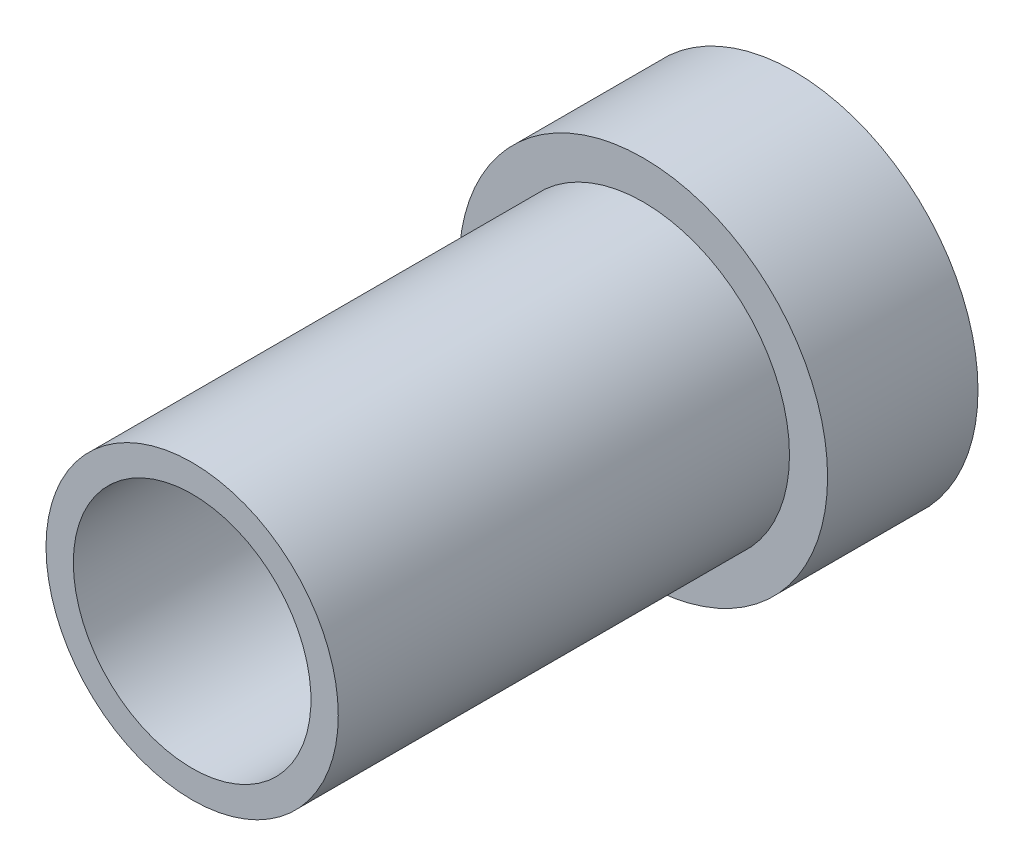
ISO-10303-21;
HEADER;
FILE_DESCRIPTION(('STEP AP214'),'2;1');
FILE_NAME('part.step','',(''),(''),'','','');
FILE_SCHEMA(('AUTOMOTIVE_DESIGN { 1 0 10303 214 1 1 1 1 }'));
ENDSEC;
DATA;
#1=APPLICATION_CONTEXT('core data for automotive mechanical design processes');
#2=APPLICATION_PROTOCOL_DEFINITION('international standard','automotive_design',2000,#1);
#3=PRODUCT_CONTEXT('',#1,'mechanical');
#4=PRODUCT('Part','Part','',(#3));
#5=PRODUCT_RELATED_PRODUCT_CATEGORY('part','',(#4));
#6=PRODUCT_DEFINITION_FORMATION('','',#4);
#7=PRODUCT_DEFINITION_CONTEXT('part definition',#1,'design');
#8=PRODUCT_DEFINITION('design','',#6,#7);
#9=PRODUCT_DEFINITION_SHAPE('','',#8);
#10=(LENGTH_UNIT() NAMED_UNIT(*) SI_UNIT(.MILLI.,.METRE.));
#11=(NAMED_UNIT(*) PLANE_ANGLE_UNIT() SI_UNIT($,.RADIAN.));
#12=(NAMED_UNIT(*) SI_UNIT($,.STERADIAN.) SOLID_ANGLE_UNIT());
#13=UNCERTAINTY_MEASURE_WITH_UNIT(LENGTH_MEASURE(1.E-05),#10,'distance_accuracy_value','');
#14=(GEOMETRIC_REPRESENTATION_CONTEXT(3) GLOBAL_UNCERTAINTY_ASSIGNED_CONTEXT((#13)) GLOBAL_UNIT_ASSIGNED_CONTEXT((#10,
#11,#12)) REPRESENTATION_CONTEXT('',''));
#15=CARTESIAN_POINT('',(0.,0.,0.));
#16=DIRECTION('',(0.,0.,1.));
#17=DIRECTION('',(1.,0.,0.));
#18=AXIS2_PLACEMENT_3D('',#15,#16,#17);
#19=CARTESIAN_POINT('',(0.,0.,80.));
#20=DIRECTION('',(0.,0.,-1.));
#21=DIRECTION('',(-1.,0.,0.));
#22=AXIS2_PLACEMENT_3D('',#19,#20,#21);
#23=CYLINDRICAL_SURFACE('',#22,18.255);
#24=CARTESIAN_POINT('',(0.,0.,0.));
#25=DIRECTION('',(0.,0.,-1.));
#26=DIRECTION('',(-1.,0.,0.));
#27=AXIS2_PLACEMENT_3D('',#24,#25,#26);
#28=CIRCLE('',#27,18.255);
#29=CARTESIAN_POINT('',(-18.255,0.,0.));
#30=VERTEX_POINT('',#29);
#31=EDGE_CURVE('E10',#30,#30,#28,.T.);
#32=ORIENTED_EDGE('',*,*,#31,.T.);
#33=EDGE_LOOP('',(#32));
#34=FACE_BOUND('',#33,.T.);
#35=CARTESIAN_POINT('',(0.,0.,20.));
#36=DIRECTION('',(0.,0.,-1.));
#37=DIRECTION('',(-1.,0.,0.));
#38=AXIS2_PLACEMENT_3D('',#35,#36,#37);
#39=CIRCLE('',#38,18.255);
#40=CARTESIAN_POINT('',(-18.255,0.,20.));
#41=VERTEX_POINT('',#40);
#42=EDGE_CURVE('E59',#41,#41,#39,.T.);
#43=ORIENTED_EDGE('',*,*,#42,.F.);
#44=EDGE_LOOP('',(#43));
#45=FACE_BOUND('',#44,.T.);
#46=ADVANCED_FACE('F31',(#34,#45),#23,.F.);
#47=CARTESIAN_POINT('',(18.255,0.,0.));
#48=DIRECTION('',(0.,0.,-1.));
#49=DIRECTION('',(-1.,0.,0.));
#50=AXIS2_PLACEMENT_3D('',#47,#48,#49);
#51=PLANE('',#50);
#52=CARTESIAN_POINT('',(0.,0.,0.));
#53=DIRECTION('',(0.,0.,-1.));
#54=DIRECTION('',(-1.,0.,0.));
#55=AXIS2_PLACEMENT_3D('',#52,#53,#54);
#56=CIRCLE('',#55,24.5);
#57=CARTESIAN_POINT('',(-24.5,0.,0.));
#58=VERTEX_POINT('',#57);
#59=EDGE_CURVE('E37',#58,#58,#56,.T.);
#60=ORIENTED_EDGE('',*,*,#59,.T.);
#61=EDGE_LOOP('',(#60));
#62=FACE_BOUND('',#61,.T.);
#63=ORIENTED_EDGE('',*,*,#31,.F.);
#64=EDGE_LOOP('',(#63));
#65=FACE_BOUND('',#64,.T.);
#66=ADVANCED_FACE('F67',(#62,#65),#51,.T.);
#67=CARTESIAN_POINT('',(0.,0.,80.));
#68=DIRECTION('',(0.,0.,-1.));
#69=DIRECTION('',(-1.,0.,0.));
#70=AXIS2_PLACEMENT_3D('',#67,#68,#69);
#71=CYLINDRICAL_SURFACE('',#70,24.5);
#72=CARTESIAN_POINT('',(0.,0.,20.));
#73=DIRECTION('',(0.,0.,-1.));
#74=DIRECTION('',(-1.,0.,0.));
#75=AXIS2_PLACEMENT_3D('',#72,#73,#74);
#76=CIRCLE('',#75,24.5);
#77=CARTESIAN_POINT('',(-24.5,0.,20.));
#78=VERTEX_POINT('',#77);
#79=EDGE_CURVE('E41',#78,#78,#76,.T.);
#80=ORIENTED_EDGE('',*,*,#79,.T.);
#81=EDGE_LOOP('',(#80));
#82=FACE_BOUND('',#81,.T.);
#83=ORIENTED_EDGE('',*,*,#59,.F.);
#84=EDGE_LOOP('',(#83));
#85=FACE_BOUND('',#84,.T.);
#86=ADVANCED_FACE('F71',(#82,#85),#71,.T.);
#87=CARTESIAN_POINT('',(24.5,0.,20.));
#88=DIRECTION('',(0.,0.,1.));
#89=DIRECTION('',(1.,0.,0.));
#90=AXIS2_PLACEMENT_3D('',#87,#88,#89);
#91=PLANE('',#90);
#92=CARTESIAN_POINT('',(0.,0.,20.));
#93=DIRECTION('',(0.,0.,-1.));
#94=DIRECTION('',(-1.,0.,0.));
#95=AXIS2_PLACEMENT_3D('',#92,#93,#94);
#96=CIRCLE('',#95,19.4323586969508);
#97=CARTESIAN_POINT('',(-19.4323586969508,0.,20.));
#98=VERTEX_POINT('',#97);
#99=EDGE_CURVE('E45',#98,#98,#96,.T.);
#100=ORIENTED_EDGE('',*,*,#99,.T.);
#101=EDGE_LOOP('',(#100));
#102=FACE_BOUND('',#101,.T.);
#103=ORIENTED_EDGE('',*,*,#79,.F.);
#104=EDGE_LOOP('',(#103));
#105=FACE_BOUND('',#104,.T.);
#106=ADVANCED_FACE('F75',(#102,#105),#91,.T.);
#107=CARTESIAN_POINT('',(0.,0.,80.));
#108=DIRECTION('',(0.,0.,-1.));
#109=DIRECTION('',(-1.,0.,0.));
#110=AXIS2_PLACEMENT_3D('',#107,#108,#109);
#111=CYLINDRICAL_SURFACE('',#110,19.4323586969508);
#112=CARTESIAN_POINT('',(0.,0.,80.));
#113=DIRECTION('',(0.,0.,-1.));
#114=DIRECTION('',(-1.,0.,0.));
#115=AXIS2_PLACEMENT_3D('',#112,#113,#114);
#116=CIRCLE('',#115,19.4323586969508);
#117=CARTESIAN_POINT('',(-19.4323586969508,0.,80.));
#118=VERTEX_POINT('',#117);
#119=EDGE_CURVE('E50',#118,#118,#116,.T.);
#120=ORIENTED_EDGE('',*,*,#119,.T.);
#121=EDGE_LOOP('',(#120));
#122=FACE_BOUND('',#121,.T.);
#123=ORIENTED_EDGE('',*,*,#99,.F.);
#124=EDGE_LOOP('',(#123));
#125=FACE_BOUND('',#124,.T.);
#126=ADVANCED_FACE('F82',(#122,#125),#111,.T.);
#127=CARTESIAN_POINT('',(19.4323586969508,0.,80.));
#128=DIRECTION('',(0.,0.,1.));
#129=DIRECTION('',(1.,0.,0.));
#130=AXIS2_PLACEMENT_3D('',#127,#128,#129);
#131=PLANE('',#130);
#132=CARTESIAN_POINT('',(0.,0.,80.));
#133=DIRECTION('',(0.,0.,-1.));
#134=DIRECTION('',(-1.,0.,0.));
#135=AXIS2_PLACEMENT_3D('',#132,#133,#134);
#136=CIRCLE('',#135,15.8);
#137=CARTESIAN_POINT('',(-15.8,0.,80.));
#138=VERTEX_POINT('',#137);
#139=EDGE_CURVE('E53',#138,#138,#136,.T.);
#140=ORIENTED_EDGE('',*,*,#139,.T.);
#141=EDGE_LOOP('',(#140));
#142=FACE_BOUND('',#141,.T.);
#143=ORIENTED_EDGE('',*,*,#119,.F.);
#144=EDGE_LOOP('',(#143));
#145=FACE_BOUND('',#144,.T.);
#146=ADVANCED_FACE('F86',(#142,#145),#131,.T.);
#147=CARTESIAN_POINT('',(0.,0.,80.));
#148=DIRECTION('',(0.,0.,-1.));
#149=DIRECTION('',(-1.,0.,0.));
#150=AXIS2_PLACEMENT_3D('',#147,#148,#149);
#151=CYLINDRICAL_SURFACE('',#150,15.8);
#152=CARTESIAN_POINT('',(0.,0.,20.));
#153=DIRECTION('',(0.,0.,-1.));
#154=DIRECTION('',(-1.,0.,0.));
#155=AXIS2_PLACEMENT_3D('',#152,#153,#154);
#156=CIRCLE('',#155,15.8);
#157=CARTESIAN_POINT('',(-15.8,0.,20.));
#158=VERTEX_POINT('',#157);
#159=EDGE_CURVE('E56',#158,#158,#156,.T.);
#160=ORIENTED_EDGE('',*,*,#159,.T.);
#161=EDGE_LOOP('',(#160));
#162=FACE_BOUND('',#161,.T.);
#163=ORIENTED_EDGE('',*,*,#139,.F.);
#164=EDGE_LOOP('',(#163));
#165=FACE_BOUND('',#164,.T.);
#166=ADVANCED_FACE('F90',(#162,#165),#151,.F.);
#167=CARTESIAN_POINT('',(15.8,0.,20.));
#168=DIRECTION('',(0.,0.,-1.));
#169=DIRECTION('',(-1.,0.,0.));
#170=AXIS2_PLACEMENT_3D('',#167,#168,#169);
#171=PLANE('',#170);
#172=ORIENTED_EDGE('',*,*,#42,.T.);
#173=EDGE_LOOP('',(#172));
#174=FACE_BOUND('',#173,.T.);
#175=ORIENTED_EDGE('',*,*,#159,.F.);
#176=EDGE_LOOP('',(#175));
#177=FACE_BOUND('',#176,.T.);
#178=ADVANCED_FACE('F63',(#174,#177),#171,.T.);
#179=CLOSED_SHELL('',(#46,#66,#86,#106,#126,#146,#166,#178));
#180=MANIFOLD_SOLID_BREP('B2',#179);
#181=ADVANCED_BREP_SHAPE_REPRESENTATION('',(#18,#180),#14);
#182=SHAPE_DEFINITION_REPRESENTATION(#9,#181);
ENDSEC;
END-ISO-10303-21;
